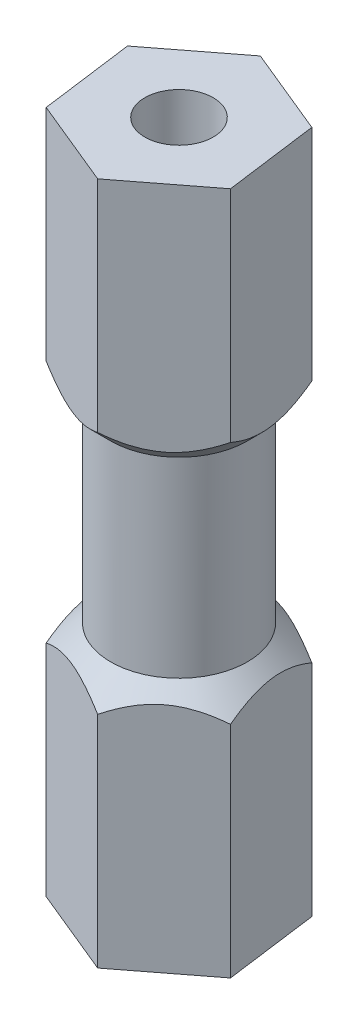
ISO-10303-21;
HEADER;
FILE_DESCRIPTION(('STEP AP214'),'2;1');
FILE_NAME('part.step','',(''),(''),'','','');
FILE_SCHEMA(('AUTOMOTIVE_DESIGN { 1 0 10303 214 1 1 1 1 }'));
ENDSEC;
DATA;
#1=APPLICATION_CONTEXT('core data for automotive mechanical design processes');
#2=APPLICATION_PROTOCOL_DEFINITION('international standard','automotive_design',2000,#1);
#3=PRODUCT_CONTEXT('',#1,'mechanical');
#4=PRODUCT('Part','Part','',(#3));
#5=PRODUCT_RELATED_PRODUCT_CATEGORY('part','',(#4));
#6=PRODUCT_DEFINITION_FORMATION('','',#4);
#7=PRODUCT_DEFINITION_CONTEXT('part definition',#1,'design');
#8=PRODUCT_DEFINITION('design','',#6,#7);
#9=PRODUCT_DEFINITION_SHAPE('','',#8);
#10=(LENGTH_UNIT() NAMED_UNIT(*) SI_UNIT(.MILLI.,.METRE.));
#11=(NAMED_UNIT(*) PLANE_ANGLE_UNIT() SI_UNIT($,.RADIAN.));
#12=(NAMED_UNIT(*) SI_UNIT($,.STERADIAN.) SOLID_ANGLE_UNIT());
#13=UNCERTAINTY_MEASURE_WITH_UNIT(LENGTH_MEASURE(1.E-05),#10,'distance_accuracy_value','');
#14=(GEOMETRIC_REPRESENTATION_CONTEXT(3) GLOBAL_UNCERTAINTY_ASSIGNED_CONTEXT((#13)) GLOBAL_UNIT_ASSIGNED_CONTEXT((#10,
#11,#12)) REPRESENTATION_CONTEXT('',''));
#15=CARTESIAN_POINT('',(0.,0.,0.));
#16=DIRECTION('',(0.,0.,1.));
#17=DIRECTION('',(1.,0.,0.));
#18=AXIS2_PLACEMENT_3D('',#15,#16,#17);
#19=CARTESIAN_POINT('',(0.,25.,0.));
#20=DIRECTION('',(0.,-1.,0.));
#21=DIRECTION('',(0.,0.,-1.));
#22=AXIS2_PLACEMENT_3D('',#19,#20,#21);
#23=CYLINDRICAL_SURFACE('',#22,2.5);
#24=CARTESIAN_POINT('',(0.,9.00000000000001,0.));
#25=DIRECTION('',(0.,-1.,0.));
#26=DIRECTION('',(0.,0.,-1.));
#27=AXIS2_PLACEMENT_3D('',#24,#25,#26);
#28=CIRCLE('',#27,2.5);
#29=CARTESIAN_POINT('',(0.,9.00000000000001,-2.5));
#30=VERTEX_POINT('',#29);
#31=EDGE_CURVE('E214',#30,#30,#28,.F.);
#32=ORIENTED_EDGE('',*,*,#31,.T.);
#33=EDGE_LOOP('',(#32));
#34=FACE_BOUND('',#33,.T.);
#35=CARTESIAN_POINT('',(0.,16.,0.));
#36=DIRECTION('',(0.,1.,0.));
#37=DIRECTION('',(0.,0.,1.));
#38=AXIS2_PLACEMENT_3D('',#35,#36,#37);
#39=CIRCLE('',#38,2.5);
#40=CARTESIAN_POINT('',(0.,16.,2.5));
#41=VERTEX_POINT('',#40);
#42=EDGE_CURVE('E204',#41,#41,#39,.F.);
#43=ORIENTED_EDGE('',*,*,#42,.T.);
#44=EDGE_LOOP('',(#43));
#45=FACE_BOUND('',#44,.T.);
#46=ADVANCED_FACE('F36',(#34,#45),#23,.T.);
#47=CARTESIAN_POINT('',(0.458624426145962,17.,3.43360796185911));
#48=DIRECTION('',(0.61025472680424,0.,0.792205256491701));
#49=DIRECTION('',(0.792205256491702,0.,-0.61025472680424));
#50=AXIS2_PLACEMENT_3D('',#47,#48,#49);
#51=PLANE('',#50);
#52=DIRECTION('',(0.792205256491701,0.,-0.61025472680424));
#53=VECTOR('',#52,1.);
#54=CARTESIAN_POINT('',(0.458624426145962,25.,3.43360796185911));
#55=LINE('',#54,#53);
#56=CARTESIAN_POINT('',(0.458624426145962,25.,3.43360796185911));
#57=VERTEX_POINT('',#56);
#58=CARTESIAN_POINT('',(3.20290393467948,25.,1.3196235770911));
#59=VERTEX_POINT('',#58);
#60=EDGE_CURVE('E176',#57,#59,#55,.T.);
#61=ORIENTED_EDGE('',*,*,#60,.F.);
#62=DIRECTION('',(0.,1.,0.));
#63=VECTOR('',#62,1.);
#64=CARTESIAN_POINT('',(0.458624426145962,17.,3.43360796185911));
#65=LINE('',#64,#63);
#66=CARTESIAN_POINT('',(0.458624426145962,16.9641016151377,3.43360796185911));
#67=VERTEX_POINT('',#66);
#68=EDGE_CURVE('E202',#67,#57,#65,.T.);
#69=ORIENTED_EDGE('',*,*,#68,.F.);
#70=CARTESIAN_POINT('',(0.458624426145962,16.9641016151377,3.43360796185911));
#71=CARTESIAN_POINT('',(0.552946646940671,16.9046273115043,3.36094929087585));
#72=CARTESIAN_POINT('',(0.648845946533506,16.8486466143714,3.28707575823494));
#73=CARTESIAN_POINT('',(0.844394459739393,16.7461483479953,3.13644004416266));
#74=CARTESIAN_POINT('',(0.944062259864258,16.6996877901198,3.05966354509507));
#75=CARTESIAN_POINT('',(1.14503747135759,16.6201005343435,2.90484751505832));
#76=CARTESIAN_POINT('',(1.24629372827786,16.586773851006,2.82684738958863));
#77=CARTESIAN_POINT('',(1.45103485264414,16.5354277758299,2.66913038646112));
#78=CARTESIAN_POINT('',(1.55451346985746,16.517370070364,2.58941832350757));
#79=CARTESIAN_POINT('',(1.73286339917489,16.5010768517386,2.45203109147486));
#80=CARTESIAN_POINT('',(1.80750452739339,16.4986656112775,2.39453323856858));
#81=CARTESIAN_POINT('',(1.9566652769835,16.502733133148,2.27963113239708));
#82=CARTESIAN_POINT('',(2.03118484660152,16.5092150115048,2.22222691899889));
#83=CARTESIAN_POINT('',(2.17951789139027,16.5306986609621,2.10796241370582));
#84=CARTESIAN_POINT('',(2.25333048312972,16.5457099577167,2.05110280233924));
#85=CARTESIAN_POINT('',(2.3996879271144,16.5834331286294,1.93836014977194));
#86=CARTESIAN_POINT('',(2.47223287613645,16.6061444122156,1.8824770340217));
#87=CARTESIAN_POINT('',(2.60100408474849,16.6528653293044,1.78328148073819));
#88=CARTESIAN_POINT('',(2.65751570690211,16.675645478675,1.73974922157174));
#89=CARTESIAN_POINT('',(2.76952470482908,16.7248761548282,1.65346600157362));
#90=CARTESIAN_POINT('',(2.82502204996649,16.7513267922701,1.61071506434156));
#91=CARTESIAN_POINT('',(2.93482762154907,16.8073056985693,1.52612919655211));
#92=CARTESIAN_POINT('',(2.989138970775,16.8368242879627,1.48429186044175));
#93=CARTESIAN_POINT('',(3.09675613798931,16.898551669424,1.40139177307215));
#94=CARTESIAN_POINT('',(3.15006254800882,16.9307588127747,1.36032856575713));
#95=CARTESIAN_POINT('',(3.20290393467948,16.9641016151377,1.3196235770911));
#96=B_SPLINE_CURVE_WITH_KNOTS('',3,(#70,#71,#72,#73,#74,#75,#76,#77,#78,#79,#80,#81,#82,#83,#84,
#85,#86,#87,#88,#89,#90,#91,#92,#93,#94,#95),.UNSPECIFIED.,.F.,.F.,(4,2,2,2,2,2,2,2,2,2,2,2,4),
(0.,0.399548839742044,0.801424624398822,1.19691998044429,1.59141997110855,1.87377108834638,
2.15622116275999,2.43898729915556,2.72173175291771,2.94627735489484,3.17082972803501,
3.39469398397017,3.61842195288712),.UNSPECIFIED.);
#97=CARTESIAN_POINT('',(3.20290393467948,16.9641016151377,1.3196235770911));
#98=VERTEX_POINT('',#97);
#99=EDGE_CURVE('E262',#67,#98,#96,.T.);
#100=ORIENTED_EDGE('',*,*,#99,.T.);
#101=DIRECTION('',(0.,1.,0.));
#102=VECTOR('',#101,1.);
#103=CARTESIAN_POINT('',(3.20290393467948,17.,1.3196235770911));
#104=LINE('',#103,#102);
#105=EDGE_CURVE('E201',#98,#59,#104,.T.);
#106=ORIENTED_EDGE('',*,*,#105,.T.);
#107=EDGE_LOOP('',(#61,#69,#100,#106));
#108=FACE_BOUND('',#107,.T.);
#109=ADVANCED_FACE('F273',(#108),#51,.T.);
#110=CARTESIAN_POINT('',(-2.74427950853352,17.,2.11398438476802));
#111=DIRECTION('',(-0.38094251373126,0.,0.924598724437855));
#112=DIRECTION('',(0.924598724437855,0.,0.38094251373126));
#113=AXIS2_PLACEMENT_3D('',#110,#111,#112);
#114=PLANE('',#113);
#115=DIRECTION('',(0.924598724437855,0.,0.38094251373126));
#116=VECTOR('',#115,1.);
#117=CARTESIAN_POINT('',(-2.74427950853352,25.,2.11398438476802));
#118=LINE('',#117,#116);
#119=CARTESIAN_POINT('',(-2.74427950853352,25.,2.11398438476802));
#120=VERTEX_POINT('',#119);
#121=EDGE_CURVE('E198',#120,#57,#118,.T.);
#122=ORIENTED_EDGE('',*,*,#121,.F.);
#123=DIRECTION('',(0.,1.,0.));
#124=VECTOR('',#123,1.);
#125=CARTESIAN_POINT('',(-2.74427950853352,17.,2.11398438476802));
#126=LINE('',#125,#124);
#127=CARTESIAN_POINT('',(-2.74427950853352,16.9641016151377,2.11398438476802));
#128=VERTEX_POINT('',#127);
#129=EDGE_CURVE('E55',#128,#120,#126,.T.);
#130=ORIENTED_EDGE('',*,*,#129,.F.);
#131=CARTESIAN_POINT('',(-2.74427950853352,16.9641016151377,2.11398438476802));
#132=CARTESIAN_POINT('',(-2.65476024921659,16.9157269497922,2.15086707860072));
#133=CARTESIAN_POINT('',(-2.56407437999802,16.8696980234631,2.18823042560407));
#134=CARTESIAN_POINT('',(-2.38077498355622,16.783998490478,2.26375133105245));
#135=CARTESIAN_POINT('',(-2.28817478965157,16.7442943295452,2.30190339605718));
#136=CARTESIAN_POINT('',(-2.10035754449794,16.672305037876,2.37928569347967));
#137=CARTESIAN_POINT('',(-2.0051374794881,16.6400288887305,2.41851716759246));
#138=CARTESIAN_POINT('',(-1.8119520952501,16.584391257025,2.49811118383178));
#139=CARTESIAN_POINT('',(-1.71397450618608,16.5610800623189,2.53847878123472));
#140=CARTESIAN_POINT('',(-1.61502958342202,16.5431603565392,2.57924492832366));
#141=B_SPLINE_CURVE_WITH_KNOTS('',3,(#131,#132,#133,#134,#135,#136,#137,#138,#139,#140),
.UNSPECIFIED.,.F.,.F.,(4,2,2,2,4),(0.,0.324780085634288,0.647775218636346,0.971158873405688,
1.29633093444723),.UNSPECIFIED.);
#142=CARTESIAN_POINT('',(-1.61502958342202,16.5431603565392,2.57924492832366));
#143=VERTEX_POINT('',#142);
#144=EDGE_CURVE('E11',#128,#143,#141,.T.);
#145=ORIENTED_EDGE('',*,*,#144,.T.);
#146=CARTESIAN_POINT('',(-1.61502958342202,16.5431603565392,2.57924492832366));
#147=CARTESIAN_POINT('',(-1.54558729717552,16.5305188398165,2.6078557390276));
#148=CARTESIAN_POINT('',(-1.47571117976237,16.5205729321314,2.63664529185045));
#149=CARTESIAN_POINT('',(-1.33546681959035,16.5062882086095,2.6944271573111));
#150=CARTESIAN_POINT('',(-1.26509853619652,16.5019498613806,2.72341948669085));
#151=CARTESIAN_POINT('',(-1.12576134312116,16.4991287729907,2.78082759161622));
#152=CARTESIAN_POINT('',(-1.05679464929385,16.5005229320105,2.8092424542111));
#153=CARTESIAN_POINT('',(-0.919172783065461,16.5088186837108,2.86594382993202));
#154=CARTESIAN_POINT('',(-0.850517531465092,16.5157187869493,2.89423037568883));
#155=CARTESIAN_POINT('',(-0.675685420253343,16.5401064692712,2.96626268783206));
#156=CARTESIAN_POINT('',(-0.56994667041001,16.5613532974712,3.00982794927952));
#157=CARTESIAN_POINT('',(-0.360777710411472,16.6150106987661,3.09600733424984));
#158=CARTESIAN_POINT('',(-0.257352275134171,16.647442434633,3.13861949048252));
#159=CARTESIAN_POINT('',(-0.0497733848083482,16.7227276288082,3.22414375326619));
#160=CARTESIAN_POINT('',(0.0542761646427828,16.7659094587898,3.26701304983008));
#161=CARTESIAN_POINT('',(0.258905277611954,16.8598312798089,3.35132197933295));
#162=CARTESIAN_POINT('',(0.35949795469334,16.9105376128439,3.39276701517121));
#163=CARTESIAN_POINT('',(0.458624426145963,16.9641016151377,3.43360796185911));
#164=B_SPLINE_CURVE_WITH_KNOTS('',3,(#146,#147,#148,#149,#150,#151,#152,#153,#154,#155,#156,
#157,#158,#159,#160,#161,#162,#163),.UNSPECIFIED.,.F.,.F.,(4,2,2,2,2,2,2,2,4),(0.,
0.228459959064639,0.45693900864685,0.680537607009109,0.904075739033715,1.25233896174798,
1.6012647756805,1.96254620732019,2.32225775447794),.UNSPECIFIED.);
#165=EDGE_CURVE('E251',#143,#67,#164,.T.);
#166=ORIENTED_EDGE('',*,*,#165,.T.);
#167=ORIENTED_EDGE('',*,*,#68,.T.);
#168=EDGE_LOOP('',(#122,#130,#145,#166,#167));
#169=FACE_BOUND('',#168,.T.);
#170=ADVANCED_FACE('F268',(#169),#114,.T.);
#171=CARTESIAN_POINT('',(-3.20290393467948,17.,-1.3196235770911));
#172=DIRECTION('',(-0.991197240535501,0.,0.132393467946154));
#173=DIRECTION('',(0.132393467946154,0.,0.991197240535501));
#174=AXIS2_PLACEMENT_3D('',#171,#172,#173);
#175=PLANE('',#174);
#176=DIRECTION('',(0.132393467946154,0.,0.991197240535501));
#177=VECTOR('',#176,1.);
#178=CARTESIAN_POINT('',(-3.20290393467948,25.,-1.3196235770911));
#179=LINE('',#178,#177);
#180=CARTESIAN_POINT('',(-3.20290393467948,25.,-1.3196235770911));
#181=VERTEX_POINT('',#180);
#182=EDGE_CURVE('E195',#181,#120,#179,.T.);
#183=ORIENTED_EDGE('',*,*,#182,.F.);
#184=DIRECTION('',(0.,1.,0.));
#185=VECTOR('',#184,1.);
#186=CARTESIAN_POINT('',(-3.20290393467948,17.,-1.3196235770911));
#187=LINE('',#186,#185);
#188=CARTESIAN_POINT('',(-3.20290393467948,16.9641016151377,-1.3196235770911));
#189=VERTEX_POINT('',#188);
#190=EDGE_CURVE('E62',#189,#181,#187,.T.);
#191=ORIENTED_EDGE('',*,*,#190,.F.);
#192=CARTESIAN_POINT('',(-3.20290393467948,16.9641016151377,-1.3196235770911));
#193=CARTESIAN_POINT('',(-3.18714079020011,16.9046273115043,-1.20160880224988));
#194=CARTESIAN_POINT('',(-3.1711140840622,16.8486466143714,-1.08162080627689));
#195=CARTESIAN_POINT('',(-3.13843398556135,16.7461483479953,-0.836952969132185));
#196=CARTESIAN_POINT('',(-3.12177748701761,16.6996877901198,-0.712249872750943));
#197=CARTESIAN_POINT('',(-3.0881904778394,16.6201005343435,-0.460792219048395));
#198=CARTESIAN_POINT('',(-3.07126851614441,16.586773851006,-0.334101665528471));
#199=CARTESIAN_POINT('',(-3.03705214701037,16.5354277758299,-0.0779321490641266));
#200=CARTESIAN_POINT('',(-3.0197587841112,16.517370070364,0.0515389936678663));
#201=CARTESIAN_POINT('',(-2.98995291567395,16.5010768517386,0.274688179236282));
#202=CARTESIAN_POINT('',(-2.9774788785033,16.4986656112775,0.368078218893769));
#203=CARTESIAN_POINT('',(-2.9525511104055,16.502733133148,0.554706270372083));
#204=CARTESIAN_POINT('',(-2.94009738812742,16.5092150115048,0.64794421743947));
#205=CARTESIAN_POINT('',(-2.91530794618713,16.5306986609621,0.833536655093754));
#206=CARTESIAN_POINT('',(-2.9029723741641,16.5457099577167,0.925890040342578));
#207=CARTESIAN_POINT('',(-2.87851309494311,16.5834331286294,1.10901063114992));
#208=CARTESIAN_POINT('',(-2.86638937157179,16.6061444122156,1.19977795779438));
#209=CARTESIAN_POINT('',(-2.84486910679185,16.6528653293044,1.36089487237019));
#210=CARTESIAN_POINT('',(-2.83542487554638,16.675645478675,1.43160150234752));
#211=CARTESIAN_POINT('',(-2.81670591407117,16.7248761548282,1.57174575000377));
#212=CARTESIAN_POINT('',(-2.80743118896132,16.7513267922701,1.64118332935139));
#213=CARTESIAN_POINT('',(-2.78908046444579,16.8073056985693,1.7785706777137));
#214=CARTESIAN_POINT('',(-2.78000394316052,16.8368242879627,1.84652435391235));
#215=CARTESIAN_POINT('',(-2.76201894512965,16.898551669424,1.98117359828806));
#216=CARTESIAN_POINT('',(-2.75311036944373,16.9307588127747,2.04786990720701));
#217=CARTESIAN_POINT('',(-2.74427950853352,16.9641016151377,2.11398438476802));
#218=B_SPLINE_CURVE_WITH_KNOTS('',3,(#192,#193,#194,#195,#196,#197,#198,#199,#200,#201,#202,
#203,#204,#205,#206,#207,#208,#209,#210,#211,#212,#213,#214,#215,#216,#217),.UNSPECIFIED.,.F.,
.F.,(4,2,2,2,2,2,2,2,2,2,2,2,4),(0.,0.399548839742042,0.801424624398822,1.19691998044429,
1.59141997110856,1.87377108834638,2.15622116275999,2.43898729915556,2.72173175291771,
2.94627735489484,3.17082972803501,3.39469398397017,3.61842195288713),.UNSPECIFIED.);
#219=EDGE_CURVE('E49',#189,#128,#218,.T.);
#220=ORIENTED_EDGE('',*,*,#219,.T.);
#221=ORIENTED_EDGE('',*,*,#129,.T.);
#222=EDGE_LOOP('',(#183,#191,#220,#221));
#223=FACE_BOUND('',#222,.T.);
#224=ADVANCED_FACE('F272',(#223),#175,.T.);
#225=CARTESIAN_POINT('',(-0.45862442614596,17.,-3.43360796185911));
#226=DIRECTION('',(-0.61025472680424,0.,-0.792205256491701));
#227=DIRECTION('',(-0.792205256491702,0.,0.61025472680424));
#228=AXIS2_PLACEMENT_3D('',#225,#226,#227);
#229=PLANE('',#228);
#230=DIRECTION('',(-0.792205256491701,0.,0.61025472680424));
#231=VECTOR('',#230,1.);
#232=CARTESIAN_POINT('',(-0.45862442614596,25.,-3.43360796185911));
#233=LINE('',#232,#231);
#234=CARTESIAN_POINT('',(-0.45862442614596,25.,-3.43360796185911));
#235=VERTEX_POINT('',#234);
#236=EDGE_CURVE('E192',#235,#181,#233,.T.);
#237=ORIENTED_EDGE('',*,*,#236,.F.);
#238=DIRECTION('',(0.,1.,0.));
#239=VECTOR('',#238,1.);
#240=CARTESIAN_POINT('',(-0.45862442614596,17.,-3.43360796185911));
#241=LINE('',#240,#239);
#242=CARTESIAN_POINT('',(-0.45862442614596,16.9641016151377,-3.43360796185911));
#243=VERTEX_POINT('',#242);
#244=EDGE_CURVE('E207',#243,#235,#241,.T.);
#245=ORIENTED_EDGE('',*,*,#244,.F.);
#246=CARTESIAN_POINT('',(-0.45862442614596,16.9641016151377,-3.43360796185911));
#247=CARTESIAN_POINT('',(-0.552946646940669,16.9046273115043,-3.36094929087585));
#248=CARTESIAN_POINT('',(-0.648845946533503,16.8486466143714,-3.28707575823493));
#249=CARTESIAN_POINT('',(-0.844394459739389,16.7461483479953,-3.13644004416266));
#250=CARTESIAN_POINT('',(-0.944062259864255,16.6996877901198,-3.05966354509507));
#251=CARTESIAN_POINT('',(-1.14503747135759,16.6201005343435,-2.90484751505832));
#252=CARTESIAN_POINT('',(-1.24629372827786,16.586773851006,-2.82684738958863));
#253=CARTESIAN_POINT('',(-1.45103485264414,16.5354277758299,-2.66913038646112));
#254=CARTESIAN_POINT('',(-1.55451346985746,16.517370070364,-2.58941832350757));
#255=CARTESIAN_POINT('',(-1.73286339917489,16.5010768517386,-2.45203109147485));
#256=CARTESIAN_POINT('',(-1.80750452739338,16.4986656112775,-2.39453323856858));
#257=CARTESIAN_POINT('',(-1.95666527698349,16.502733133148,-2.27963113239708));
#258=CARTESIAN_POINT('',(-2.03118484660152,16.5092150115048,-2.22222691899889));
#259=CARTESIAN_POINT('',(-2.17951789139026,16.5306986609621,-2.10796241370582));
#260=CARTESIAN_POINT('',(-2.25333048312972,16.5457099577167,-2.05110280233924));
#261=CARTESIAN_POINT('',(-2.3996879271144,16.5834331286294,-1.93836014977194));
#262=CARTESIAN_POINT('',(-2.47223287613644,16.6061444122156,-1.8824770340217));
#263=CARTESIAN_POINT('',(-2.60100408474849,16.6528653293044,-1.78328148073819));
#264=CARTESIAN_POINT('',(-2.65751570690211,16.675645478675,-1.73974922157174));
#265=CARTESIAN_POINT('',(-2.76952470482908,16.7248761548282,-1.65346600157362));
#266=CARTESIAN_POINT('',(-2.82502204996649,16.7513267922701,-1.61071506434155));
#267=CARTESIAN_POINT('',(-2.93482762154907,16.8073056985693,-1.52612919655211));
#268=CARTESIAN_POINT('',(-2.989138970775,16.8368242879627,-1.48429186044174));
#269=CARTESIAN_POINT('',(-3.09675613798931,16.898551669424,-1.40139177307215));
#270=CARTESIAN_POINT('',(-3.15006254800882,16.9307588127747,-1.36032856575712));
#271=CARTESIAN_POINT('',(-3.20290393467948,16.9641016151377,-1.3196235770911));
#272=B_SPLINE_CURVE_WITH_KNOTS('',3,(#246,#247,#248,#249,#250,#251,#252,#253,#254,#255,#256,
#257,#258,#259,#260,#261,#262,#263,#264,#265,#266,#267,#268,#269,#270,#271),.UNSPECIFIED.,.F.,
.F.,(4,2,2,2,2,2,2,2,2,2,2,2,4),(0.,0.399548839742042,0.801424624398821,1.19691998044429,
1.59141997110855,1.87377108834638,2.15622116275999,2.43898729915555,2.72173175291771,
2.94627735489484,3.17082972803501,3.39469398397017,3.61842195288712),.UNSPECIFIED.);
#273=EDGE_CURVE('E287',#243,#189,#272,.T.);
#274=ORIENTED_EDGE('',*,*,#273,.T.);
#275=ORIENTED_EDGE('',*,*,#190,.T.);
#276=EDGE_LOOP('',(#237,#245,#274,#275));
#277=FACE_BOUND('',#276,.T.);
#278=ADVANCED_FACE('F280',(#277),#229,.T.);
#279=CARTESIAN_POINT('',(2.74427950853352,17.,-2.11398438476802));
#280=DIRECTION('',(0.380942513731261,0.,-0.924598724437855));
#281=DIRECTION('',(-0.924598724437855,0.,-0.380942513731261));
#282=AXIS2_PLACEMENT_3D('',#279,#280,#281);
#283=PLANE('',#282);
#284=DIRECTION('',(-0.924598724437855,0.,-0.380942513731261));
#285=VECTOR('',#284,1.);
#286=CARTESIAN_POINT('',(2.74427950853352,25.,-2.11398438476802));
#287=LINE('',#286,#285);
#288=CARTESIAN_POINT('',(2.74427950853352,25.,-2.11398438476802));
#289=VERTEX_POINT('',#288);
#290=EDGE_CURVE('E189',#289,#235,#287,.T.);
#291=ORIENTED_EDGE('',*,*,#290,.F.);
#292=DIRECTION('',(0.,1.,0.));
#293=VECTOR('',#292,1.);
#294=CARTESIAN_POINT('',(2.74427950853352,17.,-2.11398438476802));
#295=LINE('',#294,#293);
#296=CARTESIAN_POINT('',(2.74427950853352,16.9641016151377,-2.11398438476802));
#297=VERTEX_POINT('',#296);
#298=EDGE_CURVE('E209',#297,#289,#295,.T.);
#299=ORIENTED_EDGE('',*,*,#298,.F.);
#300=CARTESIAN_POINT('',(2.74427950853352,16.9641016151377,-2.11398438476802));
#301=CARTESIAN_POINT('',(2.63419414325944,16.9046273115043,-2.15934048862597));
#302=CARTESIAN_POINT('',(2.5222681375287,16.8486466143714,-2.20545495195804));
#303=CARTESIAN_POINT('',(2.29403952582196,16.7461483479953,-2.29948707503048));
#304=CARTESIAN_POINT('',(2.17771522715335,16.6996877901198,-2.34741367234412));
#305=CARTESIAN_POINT('',(1.94315300648181,16.6201005343435,-2.44405529600993));
#306=CARTESIAN_POINT('',(1.82497478786655,16.586773851006,-2.49274572406016));
#307=CARTESIAN_POINT('',(1.58601729436623,16.5354277758299,-2.59119823739699));
#308=CARTESIAN_POINT('',(1.46524531425374,16.517370070364,-2.64095731717544));
#309=CARTESIAN_POINT('',(1.25708951649906,16.5010768517386,-2.72671927071113));
#310=CARTESIAN_POINT('',(1.16997435110992,16.4986656112775,-2.76261145746235));
#311=CARTESIAN_POINT('',(0.995885833422008,16.502733133148,-2.83433740276916));
#312=CARTESIAN_POINT('',(0.9089125415259,16.5092150115048,-2.87017113643836));
#313=CARTESIAN_POINT('',(0.735790054796866,16.5306986609621,-2.94149906879957));
#314=CARTESIAN_POINT('',(0.649641891034375,16.5457099577167,-2.97699284268182));
#315=CARTESIAN_POINT('',(0.478825167828705,16.5834331286294,-3.04737078092186));
#316=CARTESIAN_POINT('',(0.394156495435348,16.6061444122156,-3.08225499181608));
#317=CARTESIAN_POINT('',(0.243865022043357,16.6528653293044,-3.14417635310838));
#318=CARTESIAN_POINT('',(0.177909168644272,16.675645478675,-3.17135072391926));
#319=CARTESIAN_POINT('',(0.0471812092420939,16.7248761548282,-3.22521175157739));
#320=CARTESIAN_POINT('',(-0.0175908610051712,16.7513267922701,-3.25189839369295));
#321=CARTESIAN_POINT('',(-0.145747157103272,16.8073056985693,-3.30469987426581));
#322=CARTESIAN_POINT('',(-0.209135027614485,16.8368242879627,-3.33081621435409));
#323=CARTESIAN_POINT('',(-0.334737192859659,16.898551669424,-3.38256537136021));
#324=CARTESIAN_POINT('',(-0.39695217856509,16.9307588127747,-3.40819847296414));
#325=CARTESIAN_POINT('',(-0.458624426145959,16.9641016151377,-3.43360796185911));
#326=B_SPLINE_CURVE_WITH_KNOTS('',3,(#300,#301,#302,#303,#304,#305,#306,#307,#308,#309,#310,
#311,#312,#313,#314,#315,#316,#317,#318,#319,#320,#321,#322,#323,#324,#325),.UNSPECIFIED.,.F.,
.F.,(4,2,2,2,2,2,2,2,2,2,2,2,4),(0.,0.399548839742043,0.801424624398822,1.19691998044429,
1.59141997110856,1.87377108834638,2.15622116275999,2.43898729915556,2.72173175291771,
2.94627735489484,3.17082972803501,3.39469398397017,3.61842195288713),.UNSPECIFIED.);
#327=EDGE_CURVE('E292',#297,#243,#326,.T.);
#328=ORIENTED_EDGE('',*,*,#327,.T.);
#329=ORIENTED_EDGE('',*,*,#244,.T.);
#330=EDGE_LOOP('',(#291,#299,#328,#329));
#331=FACE_BOUND('',#330,.T.);
#332=ADVANCED_FACE('F302',(#331),#283,.T.);
#333=CARTESIAN_POINT('',(3.20290393467948,17.,1.3196235770911));
#334=DIRECTION('',(0.991197240535501,0.,-0.132393467946154));
#335=DIRECTION('',(-0.132393467946154,0.,-0.991197240535501));
#336=AXIS2_PLACEMENT_3D('',#333,#334,#335);
#337=PLANE('',#336);
#338=DIRECTION('',(-0.132393467946154,0.,-0.991197240535501));
#339=VECTOR('',#338,1.);
#340=CARTESIAN_POINT('',(3.20290393467948,25.,1.3196235770911));
#341=LINE('',#340,#339);
#342=EDGE_CURVE('E186',#59,#289,#341,.T.);
#343=ORIENTED_EDGE('',*,*,#342,.F.);
#344=ORIENTED_EDGE('',*,*,#105,.F.);
#345=CARTESIAN_POINT('',(3.20290393467948,16.9641016151377,1.3196235770911));
#346=CARTESIAN_POINT('',(3.18714079020011,16.9046273115043,1.20160880224988));
#347=CARTESIAN_POINT('',(3.1711140840622,16.8486466143714,1.0816208062769));
#348=CARTESIAN_POINT('',(3.13843398556135,16.7461483479953,0.836952969132185));
#349=CARTESIAN_POINT('',(3.12177748701761,16.6996877901198,0.712249872750943));
#350=CARTESIAN_POINT('',(3.0881904778394,16.6201005343435,0.460792219048393));
#351=CARTESIAN_POINT('',(3.07126851614441,16.586773851006,0.334101665528469));
#352=CARTESIAN_POINT('',(3.03705214701037,16.5354277758299,0.0779321490641236));
#353=CARTESIAN_POINT('',(3.0197587841112,16.517370070364,-0.0515389936678698));
#354=CARTESIAN_POINT('',(2.98995291567395,16.5010768517386,-0.274688179236286));
#355=CARTESIAN_POINT('',(2.9774788785033,16.4986656112775,-0.368078218893774));
#356=CARTESIAN_POINT('',(2.9525511104055,16.502733133148,-0.554706270372088));
#357=CARTESIAN_POINT('',(2.94009738812742,16.5092150115048,-0.647944217439476));
#358=CARTESIAN_POINT('',(2.91530794618713,16.5306986609621,-0.833536655093759));
#359=CARTESIAN_POINT('',(2.9029723741641,16.5457099577167,-0.925890040342584));
#360=CARTESIAN_POINT('',(2.8785130949431,16.5834331286294,-1.10901063114993));
#361=CARTESIAN_POINT('',(2.86638937157179,16.6061444122156,-1.19977795779439));
#362=CARTESIAN_POINT('',(2.84486910679185,16.6528653293044,-1.3608948723702));
#363=CARTESIAN_POINT('',(2.83542487554638,16.675645478675,-1.43160150234752));
#364=CARTESIAN_POINT('',(2.81670591407117,16.7248761548282,-1.57174575000378));
#365=CARTESIAN_POINT('',(2.80743118896131,16.7513267922701,-1.6411833293514));
#366=CARTESIAN_POINT('',(2.78908046444579,16.8073056985693,-1.7785706777137));
#367=CARTESIAN_POINT('',(2.78000394316052,16.8368242879627,-1.84652435391235));
#368=CARTESIAN_POINT('',(2.76201894512965,16.898551669424,-1.98117359828806));
#369=CARTESIAN_POINT('',(2.75311036944373,16.9307588127747,-2.04786990720701));
#370=CARTESIAN_POINT('',(2.74427950853352,16.9641016151377,-2.11398438476802));
#371=B_SPLINE_CURVE_WITH_KNOTS('',3,(#345,#346,#347,#348,#349,#350,#351,#352,#353,#354,#355,
#356,#357,#358,#359,#360,#361,#362,#363,#364,#365,#366,#367,#368,#369,#370),.UNSPECIFIED.,.F.,
.F.,(4,2,2,2,2,2,2,2,2,2,2,2,4),(0.,0.399548839742046,0.801424624398827,1.19691998044429,
1.59141997110856,1.87377108834639,2.15622116276,2.43898729915557,2.72173175291772,
2.94627735489485,3.17082972803502,3.39469398397018,3.61842195288713),.UNSPECIFIED.);
#372=EDGE_CURVE('E297',#98,#297,#371,.T.);
#373=ORIENTED_EDGE('',*,*,#372,.T.);
#374=ORIENTED_EDGE('',*,*,#298,.T.);
#375=EDGE_LOOP('',(#343,#344,#373,#374));
#376=FACE_BOUND('',#375,.T.);
#377=ADVANCED_FACE('F305',(#376),#337,.T.);
#378=CARTESIAN_POINT('',(0.,25.,0.));
#379=DIRECTION('',(0.,1.,0.));
#380=DIRECTION('',(0.,0.,1.));
#381=AXIS2_PLACEMENT_3D('',#378,#379,#380);
#382=PLANE('',#381);
#383=CARTESIAN_POINT('',(0.,25.,0.));
#384=DIRECTION('',(0.,-1.,0.));
#385=DIRECTION('',(0.,0.,-1.));
#386=AXIS2_PLACEMENT_3D('',#383,#384,#385);
#387=CIRCLE('',#386,1.25);
#388=CARTESIAN_POINT('',(0.,25.,-1.25));
#389=VERTEX_POINT('',#388);
#390=EDGE_CURVE('E510',#389,#389,#387,.T.);
#391=ORIENTED_EDGE('',*,*,#390,.T.);
#392=EDGE_LOOP('',(#391));
#393=FACE_BOUND('',#392,.T.);
#394=ORIENTED_EDGE('',*,*,#60,.T.);
#395=ORIENTED_EDGE('',*,*,#342,.T.);
#396=ORIENTED_EDGE('',*,*,#290,.T.);
#397=ORIENTED_EDGE('',*,*,#236,.T.);
#398=ORIENTED_EDGE('',*,*,#182,.T.);
#399=ORIENTED_EDGE('',*,*,#121,.T.);
#400=EDGE_LOOP('',(#394,#395,#396,#397,#398,#399));
#401=FACE_BOUND('',#400,.T.);
#402=ADVANCED_FACE('F309',(#393,#401),#382,.T.);
#403=CARTESIAN_POINT('',(2.74427950853352,8.,-2.11398438476802));
#404=DIRECTION('',(0.991197240535501,0.,-0.132393467946154));
#405=DIRECTION('',(-0.132393467946154,0.,-0.991197240535501));
#406=AXIS2_PLACEMENT_3D('',#403,#404,#405);
#407=PLANE('',#406);
#408=DIRECTION('',(0.132393467946154,0.,0.991197240535501));
#409=VECTOR('',#408,1.);
#410=CARTESIAN_POINT('',(2.74427950853352,0.,-2.11398438476802));
#411=LINE('',#410,#409);
#412=CARTESIAN_POINT('',(2.74427950853352,0.,-2.11398438476802));
#413=VERTEX_POINT('',#412);
#414=CARTESIAN_POINT('',(3.20290393467948,0.,1.3196235770911));
#415=VERTEX_POINT('',#414);
#416=EDGE_CURVE('E139',#413,#415,#411,.T.);
#417=ORIENTED_EDGE('',*,*,#416,.F.);
#418=DIRECTION('',(0.,-1.,0.));
#419=VECTOR('',#418,1.);
#420=CARTESIAN_POINT('',(2.74427950853352,8.,-2.11398438476802));
#421=LINE('',#420,#419);
#422=CARTESIAN_POINT('',(2.74427950853352,8.03589838486226,-2.11398438476802));
#423=VERTEX_POINT('',#422);
#424=EDGE_CURVE('E174',#423,#413,#421,.T.);
#425=ORIENTED_EDGE('',*,*,#424,.F.);
#426=CARTESIAN_POINT('',(2.74427950853352,8.03589838486226,-2.11398438476802));
#427=CARTESIAN_POINT('',(2.76004265301289,8.09537268849571,-1.9959696099268));
#428=CARTESIAN_POINT('',(2.7760693591508,8.15135338562856,-1.87598161395381));
#429=CARTESIAN_POINT('',(2.80874945765166,8.2538516520047,-1.6313137768091));
#430=CARTESIAN_POINT('',(2.82540595619539,8.30031220988016,-1.50661068042786));
#431=CARTESIAN_POINT('',(2.85899296537361,8.37989946565652,-1.25515302672531));
#432=CARTESIAN_POINT('',(2.87591492706859,8.413226148994,-1.12846247320539));
#433=CARTESIAN_POINT('',(2.91013129620263,8.46457222417013,-0.872292956741048));
#434=CARTESIAN_POINT('',(2.92742465910181,8.48262992963597,-0.742821814009055));
#435=CARTESIAN_POINT('',(2.95723052753905,8.49892314826136,-0.519672628440641));
#436=CARTESIAN_POINT('',(2.9697045647097,8.50133438872248,-0.426282588783153));
#437=CARTESIAN_POINT('',(2.9946323328075,8.49726686685198,-0.239654537304839));
#438=CARTESIAN_POINT('',(3.00708605508558,8.49078498849517,-0.146416590237452));
#439=CARTESIAN_POINT('',(3.03187549702587,8.4693013390379,0.039175847416832));
#440=CARTESIAN_POINT('',(3.04421106904891,8.45429004228332,0.131529232665657));
#441=CARTESIAN_POINT('',(3.0686703482699,8.41656687137056,0.314649823473001));
#442=CARTESIAN_POINT('',(3.08079407164121,8.39385558778436,0.405417150117458));
#443=CARTESIAN_POINT('',(3.10231433642116,8.34713467069563,0.566534064693269));
#444=CARTESIAN_POINT('',(3.11175856766662,8.32435452132502,0.637240694670598));
#445=CARTESIAN_POINT('',(3.13047752914183,8.27512384517184,0.777384942326854));
#446=CARTESIAN_POINT('',(3.13975225425169,8.24867320772993,0.846822521674473));
#447=CARTESIAN_POINT('',(3.15810297876721,8.19269430143066,0.98420987003678));
#448=CARTESIAN_POINT('',(3.16717950005249,8.1631757120373,1.05216354623543));
#449=CARTESIAN_POINT('',(3.18516449808335,8.10144833057595,1.18681279061114));
#450=CARTESIAN_POINT('',(3.19407307376928,8.06924118722529,1.2535090995301));
#451=CARTESIAN_POINT('',(3.20290393467948,8.03589838486226,1.3196235770911));
#452=B_SPLINE_CURVE_WITH_KNOTS('',3,(#426,#427,#428,#429,#430,#431,#432,#433,#434,#435,#436,
#437,#438,#439,#440,#441,#442,#443,#444,#445,#446,#447,#448,#449,#450,#451),.UNSPECIFIED.,.F.,
.F.,(4,2,2,2,2,2,2,2,2,2,2,2,4),(0.,0.399548839742043,0.801424624398823,1.19691998044429,
1.59141997110855,1.87377108834638,2.15622116275999,2.43898729915556,2.72173175291771,
2.94627735489484,3.17082972803501,3.39469398397018,3.61842195288713),.UNSPECIFIED.);
#453=CARTESIAN_POINT('',(3.20290393467948,8.03589838486226,1.3196235770911));
#454=VERTEX_POINT('',#453);
#455=EDGE_CURVE('E142',#423,#454,#452,.T.);
#456=ORIENTED_EDGE('',*,*,#455,.T.);
#457=DIRECTION('',(0.,-1.,0.));
#458=VECTOR('',#457,1.);
#459=CARTESIAN_POINT('',(3.20290393467948,8.,1.3196235770911));
#460=LINE('',#459,#458);
#461=EDGE_CURVE('E135',#454,#415,#460,.T.);
#462=ORIENTED_EDGE('',*,*,#461,.T.);
#463=EDGE_LOOP('',(#417,#425,#456,#462));
#464=FACE_BOUND('',#463,.T.);
#465=ADVANCED_FACE('F137',(#464),#407,.T.);
#466=CARTESIAN_POINT('',(-0.45862442614596,8.,-3.43360796185911));
#467=DIRECTION('',(0.380942513731261,0.,-0.924598724437855));
#468=DIRECTION('',(-0.924598724437855,0.,-0.380942513731261));
#469=AXIS2_PLACEMENT_3D('',#466,#467,#468);
#470=PLANE('',#469);
#471=DIRECTION('',(0.924598724437855,0.,0.380942513731261));
#472=VECTOR('',#471,1.);
#473=CARTESIAN_POINT('',(-0.45862442614596,0.,-3.43360796185911));
#474=LINE('',#473,#472);
#475=CARTESIAN_POINT('',(-0.45862442614596,0.,-3.43360796185911));
#476=VERTEX_POINT('',#475);
#477=EDGE_CURVE('E147',#476,#413,#474,.T.);
#478=ORIENTED_EDGE('',*,*,#477,.F.);
#479=DIRECTION('',(0.,-1.,0.));
#480=VECTOR('',#479,1.);
#481=CARTESIAN_POINT('',(-0.45862442614596,8.,-3.43360796185911));
#482=LINE('',#481,#480);
#483=CARTESIAN_POINT('',(-0.45862442614596,8.03589838486226,-3.43360796185911));
#484=VERTEX_POINT('',#483);
#485=EDGE_CURVE('E177',#484,#476,#482,.T.);
#486=ORIENTED_EDGE('',*,*,#485,.F.);
#487=CARTESIAN_POINT('',(-0.45862442614596,8.03589838486226,-3.43360796185911));
#488=CARTESIAN_POINT('',(-0.369105166829032,8.08427305020784,-3.39672526802641));
#489=CARTESIAN_POINT('',(-0.278419297610459,8.13030197653688,-3.35936192102306));
#490=CARTESIAN_POINT('',(-0.0951199011686616,8.21600150952199,-3.28384101557468));
#491=CARTESIAN_POINT('',(-0.0025197072640104,8.2557056704548,-3.24568895056995));
#492=CARTESIAN_POINT('',(0.185297537889624,8.32769496212401,-3.16830665314746));
#493=CARTESIAN_POINT('',(0.280517602899462,8.35997111126952,-3.12907517903467));
#494=CARTESIAN_POINT('',(0.473702987137462,8.41560874297504,-3.04948116279535));
#495=CARTESIAN_POINT('',(0.571680576201477,8.43891993768112,-3.00911356539242));
#496=CARTESIAN_POINT('',(0.670625498965541,8.45683964346084,-2.96834741830347));
#497=B_SPLINE_CURVE_WITH_KNOTS('',3,(#487,#488,#489,#490,#491,#492,#493,#494,#495,#496),
.UNSPECIFIED.,.F.,.F.,(4,2,2,2,4),(0.,0.324780085634286,0.647775218636343,0.971158873405685,
1.29633093444723),.UNSPECIFIED.);
#498=CARTESIAN_POINT('',(0.670625498965542,8.45683964346084,-2.96834741830347));
#499=VERTEX_POINT('',#498);
#500=EDGE_CURVE('E245',#484,#499,#497,.T.);
#501=ORIENTED_EDGE('',*,*,#500,.T.);
#502=CARTESIAN_POINT('',(0.670625498965542,8.45683964346084,-2.96834741830347));
#503=CARTESIAN_POINT('',(0.740067785212044,8.4694811601835,-2.93973660759954));
#504=CARTESIAN_POINT('',(0.809943902625188,8.47942706786863,-2.91094705477669));
#505=CARTESIAN_POINT('',(0.950188262797211,8.49371179139053,-2.85316518931603));
#506=CARTESIAN_POINT('',(1.02055654619104,8.49805013861937,-2.82417285993628));
#507=CARTESIAN_POINT('',(1.1598937392664,8.50087122700931,-2.76676475501092));
#508=CARTESIAN_POINT('',(1.22886043309371,8.49947706798954,-2.73834989241603));
#509=CARTESIAN_POINT('',(1.3664822993221,8.49118131628924,-2.68164851669511));
#510=CARTESIAN_POINT('',(1.43513755092247,8.4842812130507,-2.65336197093831));
#511=CARTESIAN_POINT('',(1.60996966213422,8.45989353072877,-2.58132965879507));
#512=CARTESIAN_POINT('',(1.71570841197755,8.43864670252881,-2.53776439734761));
#513=CARTESIAN_POINT('',(1.92487737197609,8.38498930123391,-2.45158501237729));
#514=CARTESIAN_POINT('',(2.02830280725339,8.35255756536695,-2.40897285614461));
#515=CARTESIAN_POINT('',(2.23588169757921,8.27727237119179,-2.32344859336094));
#516=CARTESIAN_POINT('',(2.33993124703035,8.2340905412102,-2.28057929679706));
#517=CARTESIAN_POINT('',(2.54456035999952,8.14016872019114,-2.19627036729419));
#518=CARTESIAN_POINT('',(2.6451530370809,8.08946238715607,-2.15482533145592));
#519=CARTESIAN_POINT('',(2.74427950853352,8.03589838486226,-2.11398438476802));
#520=B_SPLINE_CURVE_WITH_KNOTS('',3,(#502,#503,#504,#505,#506,#507,#508,#509,#510,#511,#512,
#513,#514,#515,#516,#517,#518,#519),.UNSPECIFIED.,.F.,.F.,(4,2,2,2,2,2,2,2,4),(0.,
0.228459959064639,0.45693900864685,0.680537607009108,0.904075739033714,1.25233896174798,
1.60126477568051,1.96254620732019,2.32225775447794),.UNSPECIFIED.);
#521=EDGE_CURVE('E217',#499,#423,#520,.T.);
#522=ORIENTED_EDGE('',*,*,#521,.T.);
#523=ORIENTED_EDGE('',*,*,#424,.T.);
#524=EDGE_LOOP('',(#478,#486,#501,#522,#523));
#525=FACE_BOUND('',#524,.T.);
#526=ADVANCED_FACE('F232',(#525),#470,.T.);
#527=CARTESIAN_POINT('',(-3.20290393467948,8.,-1.3196235770911));
#528=DIRECTION('',(-0.61025472680424,0.,-0.792205256491701));
#529=DIRECTION('',(-0.792205256491702,0.,0.61025472680424));
#530=AXIS2_PLACEMENT_3D('',#527,#528,#529);
#531=PLANE('',#530);
#532=DIRECTION('',(0.792205256491701,0.,-0.61025472680424));
#533=VECTOR('',#532,1.);
#534=CARTESIAN_POINT('',(-3.20290393467948,0.,-1.3196235770911));
#535=LINE('',#534,#533);
#536=CARTESIAN_POINT('',(-3.20290393467948,0.,-1.3196235770911));
#537=VERTEX_POINT('',#536);
#538=EDGE_CURVE('E171',#537,#476,#535,.T.);
#539=ORIENTED_EDGE('',*,*,#538,.F.);
#540=DIRECTION('',(0.,-1.,0.));
#541=VECTOR('',#540,1.);
#542=CARTESIAN_POINT('',(-3.20290393467948,8.,-1.3196235770911));
#543=LINE('',#542,#541);
#544=CARTESIAN_POINT('',(-3.20290393467948,8.03589838486226,-1.3196235770911));
#545=VERTEX_POINT('',#544);
#546=EDGE_CURVE('E179',#545,#537,#543,.T.);
#547=ORIENTED_EDGE('',*,*,#546,.F.);
#548=CARTESIAN_POINT('',(-3.20290393467948,8.03589838486226,-1.3196235770911));
#549=CARTESIAN_POINT('',(-3.10858171388477,8.09537268849571,-1.39228224807436));
#550=CARTESIAN_POINT('',(-3.01268241429194,8.15135338562856,-1.46615578071528));
#551=CARTESIAN_POINT('',(-2.81713390108605,8.2538516520047,-1.61679149478755));
#552=CARTESIAN_POINT('',(-2.71746610096119,8.30031220988016,-1.69356799385514));
#553=CARTESIAN_POINT('',(-2.51649088946785,8.37989946565652,-1.84838402389189));
#554=CARTESIAN_POINT('',(-2.41523463254758,8.413226148994,-1.92638414936158));
#555=CARTESIAN_POINT('',(-2.2104935081813,8.46457222417013,-2.08410115248909));
#556=CARTESIAN_POINT('',(-2.10701489096798,8.48262992963597,-2.16381321544264));
#557=CARTESIAN_POINT('',(-1.92866496165055,8.49892314826136,-2.30120044747536));
#558=CARTESIAN_POINT('',(-1.85402383343206,8.50133438872248,-2.35869830038163));
#559=CARTESIAN_POINT('',(-1.70486308384195,8.49726686685198,-2.47360040655313));
#560=CARTESIAN_POINT('',(-1.63034351422392,8.49078498849517,-2.53100461995132));
#561=CARTESIAN_POINT('',(-1.48201046943518,8.4693013390379,-2.64526912524439));
#562=CARTESIAN_POINT('',(-1.40819787769572,8.45429004228332,-2.70212873661097));
#563=CARTESIAN_POINT('',(-1.26184043371104,8.41656687137056,-2.81487138917827));
#564=CARTESIAN_POINT('',(-1.189295484689,8.39385558778436,-2.87075450492851));
#565=CARTESIAN_POINT('',(-1.06052427607695,8.34713467069563,-2.96995005821202));
#566=CARTESIAN_POINT('',(-1.00401265392333,8.32435452132502,-3.01348231737847));
#567=CARTESIAN_POINT('',(-0.892003655996361,8.27512384517184,-3.09976553737659));
#568=CARTESIAN_POINT('',(-0.836506310858955,8.24867320772993,-3.14251647460866));
#569=CARTESIAN_POINT('',(-0.726700739276376,8.19269430143066,-3.2271023423981));
#570=CARTESIAN_POINT('',(-0.672389390050442,8.1631757120373,-3.26893967850847));
#571=CARTESIAN_POINT('',(-0.564772222836132,8.10144833057595,-3.35183976587806));
#572=CARTESIAN_POINT('',(-0.511465812816624,8.06924118722529,-3.39290297319308));
#573=CARTESIAN_POINT('',(-0.45862442614596,8.03589838486226,-3.43360796185911));
#574=B_SPLINE_CURVE_WITH_KNOTS('',3,(#548,#549,#550,#551,#552,#553,#554,#555,#556,#557,#558,
#559,#560,#561,#562,#563,#564,#565,#566,#567,#568,#569,#570,#571,#572,#573),.UNSPECIFIED.,.F.,
.F.,(4,2,2,2,2,2,2,2,2,2,2,2,4),(0.,0.399548839742043,0.801424624398822,1.19691998044429,
1.59141997110855,1.87377108834638,2.15622116275999,2.43898729915556,2.72173175291771,
2.94627735489484,3.17082972803501,3.39469398397017,3.61842195288712),.UNSPECIFIED.);
#575=EDGE_CURVE('E252',#545,#484,#574,.T.);
#576=ORIENTED_EDGE('',*,*,#575,.T.);
#577=ORIENTED_EDGE('',*,*,#485,.T.);
#578=EDGE_LOOP('',(#539,#547,#576,#577));
#579=FACE_BOUND('',#578,.T.);
#580=ADVANCED_FACE('F237',(#579),#531,.T.);
#581=CARTESIAN_POINT('',(-2.74427950853352,8.,2.11398438476802));
#582=DIRECTION('',(-0.991197240535501,0.,0.132393467946154));
#583=DIRECTION('',(0.132393467946154,0.,0.991197240535501));
#584=AXIS2_PLACEMENT_3D('',#581,#582,#583);
#585=PLANE('',#584);
#586=DIRECTION('',(-0.132393467946154,0.,-0.991197240535501));
#587=VECTOR('',#586,1.);
#588=CARTESIAN_POINT('',(-2.74427950853352,0.,2.11398438476802));
#589=LINE('',#588,#587);
#590=CARTESIAN_POINT('',(-2.74427950853352,0.,2.11398438476802));
#591=VERTEX_POINT('',#590);
#592=EDGE_CURVE('E168',#591,#537,#589,.T.);
#593=ORIENTED_EDGE('',*,*,#592,.F.);
#594=DIRECTION('',(0.,-1.,0.));
#595=VECTOR('',#594,1.);
#596=CARTESIAN_POINT('',(-2.74427950853352,8.,2.11398438476802));
#597=LINE('',#596,#595);
#598=CARTESIAN_POINT('',(-2.74427950853352,8.03589838486226,2.11398438476802));
#599=VERTEX_POINT('',#598);
#600=EDGE_CURVE('E181',#599,#591,#597,.T.);
#601=ORIENTED_EDGE('',*,*,#600,.F.);
#602=CARTESIAN_POINT('',(-2.74427950853352,8.03589838486226,2.11398438476802));
#603=CARTESIAN_POINT('',(-2.76004265301289,8.09537268849571,1.9959696099268));
#604=CARTESIAN_POINT('',(-2.7760693591508,8.15135338562856,1.87598161395381));
#605=CARTESIAN_POINT('',(-2.80874945765166,8.2538516520047,1.6313137768091));
#606=CARTESIAN_POINT('',(-2.82540595619539,8.30031220988016,1.50661068042786));
#607=CARTESIAN_POINT('',(-2.8589929653736,8.37989946565652,1.25515302672531));
#608=CARTESIAN_POINT('',(-2.87591492706859,8.413226148994,1.12846247320539));
#609=CARTESIAN_POINT('',(-2.91013129620263,8.46457222417013,0.872292956741047));
#610=CARTESIAN_POINT('',(-2.92742465910181,8.48262992963597,0.742821814009055));
#611=CARTESIAN_POINT('',(-2.95723052753905,8.49892314826137,0.51967262844064));
#612=CARTESIAN_POINT('',(-2.9697045647097,8.50133438872248,0.426282588783153));
#613=CARTESIAN_POINT('',(-2.9946323328075,8.49726686685198,0.239654537304839));
#614=CARTESIAN_POINT('',(-3.00708605508558,8.49078498849517,0.146416590237452));
#615=CARTESIAN_POINT('',(-3.03187549702587,8.4693013390379,-0.039175847416832));
#616=CARTESIAN_POINT('',(-3.04421106904891,8.45429004228332,-0.131529232665657));
#617=CARTESIAN_POINT('',(-3.0686703482699,8.41656687137056,-0.314649823473001));
#618=CARTESIAN_POINT('',(-3.08079407164121,8.39385558778436,-0.405417150117458));
#619=CARTESIAN_POINT('',(-3.10231433642116,8.34713467069563,-0.566534064693268));
#620=CARTESIAN_POINT('',(-3.11175856766662,8.32435452132502,-0.637240694670596));
#621=CARTESIAN_POINT('',(-3.13047752914183,8.27512384517184,-0.777384942326851));
#622=CARTESIAN_POINT('',(-3.13975225425169,8.24867320772993,-0.846822521674471));
#623=CARTESIAN_POINT('',(-3.15810297876721,8.19269430143066,-0.984209870036777));
#624=CARTESIAN_POINT('',(-3.16717950005249,8.1631757120373,-1.05216354623543));
#625=CARTESIAN_POINT('',(-3.18516449808335,8.10144833057596,-1.18681279061114));
#626=CARTESIAN_POINT('',(-3.19407307376928,8.06924118722529,-1.25350909953009));
#627=CARTESIAN_POINT('',(-3.20290393467948,8.03589838486226,-1.3196235770911));
#628=B_SPLINE_CURVE_WITH_KNOTS('',3,(#602,#603,#604,#605,#606,#607,#608,#609,#610,#611,#612,
#613,#614,#615,#616,#617,#618,#619,#620,#621,#622,#623,#624,#625,#626,#627),.UNSPECIFIED.,.F.,
.F.,(4,2,2,2,2,2,2,2,2,2,2,2,4),(0.,0.399548839742044,0.801424624398825,1.19691998044429,
1.59141997110856,1.87377108834638,2.15622116275999,2.43898729915556,2.72173175291771,
2.94627735489484,3.17082972803501,3.39469398397017,3.61842195288713),.UNSPECIFIED.);
#629=EDGE_CURVE('E539',#599,#545,#628,.T.);
#630=ORIENTED_EDGE('',*,*,#629,.T.);
#631=ORIENTED_EDGE('',*,*,#546,.T.);
#632=EDGE_LOOP('',(#593,#601,#630,#631));
#633=FACE_BOUND('',#632,.T.);
#634=ADVANCED_FACE('F379',(#633),#585,.T.);
#635=CARTESIAN_POINT('',(0.458624426145962,8.,3.43360796185911));
#636=DIRECTION('',(-0.38094251373126,0.,0.924598724437855));
#637=DIRECTION('',(0.924598724437855,0.,0.38094251373126));
#638=AXIS2_PLACEMENT_3D('',#635,#636,#637);
#639=PLANE('',#638);
#640=DIRECTION('',(-0.924598724437855,0.,-0.38094251373126));
#641=VECTOR('',#640,1.);
#642=CARTESIAN_POINT('',(0.458624426145962,0.,3.43360796185911));
#643=LINE('',#642,#641);
#644=CARTESIAN_POINT('',(0.458624426145962,0.,3.43360796185911));
#645=VERTEX_POINT('',#644);
#646=EDGE_CURVE('E155',#645,#591,#643,.T.);
#647=ORIENTED_EDGE('',*,*,#646,.F.);
#648=DIRECTION('',(0.,-1.,0.));
#649=VECTOR('',#648,1.);
#650=CARTESIAN_POINT('',(0.458624426145962,8.,3.43360796185911));
#651=LINE('',#650,#649);
#652=CARTESIAN_POINT('',(0.458624426145962,8.03589838486226,3.43360796185911));
#653=VERTEX_POINT('',#652);
#654=EDGE_CURVE('E146',#653,#645,#651,.T.);
#655=ORIENTED_EDGE('',*,*,#654,.F.);
#656=CARTESIAN_POINT('',(0.458624426145963,8.03589838486226,3.43360796185911));
#657=CARTESIAN_POINT('',(0.348539060871884,8.09537268849571,3.38825185800117));
#658=CARTESIAN_POINT('',(0.236613055141136,8.15135338562856,3.34213739466909));
#659=CARTESIAN_POINT('',(0.00838444343439654,8.2538516520047,3.24810527159665));
#660=CARTESIAN_POINT('',(-0.107939855234207,8.30031220988015,3.20017867428301));
#661=CARTESIAN_POINT('',(-0.34250207590575,8.37989946565651,3.1035370506172));
#662=CARTESIAN_POINT('',(-0.46068029452101,8.413226148994,3.05484662256697));
#663=CARTESIAN_POINT('',(-0.699637788021327,8.46457222417013,2.95639410923014));
#664=CARTESIAN_POINT('',(-0.820409768133821,8.48262992963597,2.90663502945169));
#665=CARTESIAN_POINT('',(-1.0285655658885,8.49892314826136,2.820873075916));
#666=CARTESIAN_POINT('',(-1.11568073127764,8.50133438872248,2.78498088916479));
#667=CARTESIAN_POINT('',(-1.28976924896555,8.49726686685198,2.71325494385797));
#668=CARTESIAN_POINT('',(-1.37674254086166,8.49078498849517,2.67742121018877));
#669=CARTESIAN_POINT('',(-1.5498650275907,8.4693013390379,2.60609327782756));
#670=CARTESIAN_POINT('',(-1.63601319135319,8.45429004228332,2.57059950394531));
#671=CARTESIAN_POINT('',(-1.80682991455886,8.41656687137056,2.50022156570527));
#672=CARTESIAN_POINT('',(-1.89149858695221,8.39385558778436,2.46533735481106));
#673=CARTESIAN_POINT('',(-2.0417900603442,8.34713467069563,2.40341599351875));
#674=CARTESIAN_POINT('',(-2.10774591374329,8.32435452132502,2.37624162270787));
#675=CARTESIAN_POINT('',(-2.23847387314547,8.27512384517184,2.32238059504974));
#676=CARTESIAN_POINT('',(-2.30324594339273,8.24867320772993,2.29569395293419));
#677=CARTESIAN_POINT('',(-2.43140223949083,8.19269430143066,2.24289247236132));
#678=CARTESIAN_POINT('',(-2.49479011000205,8.1631757120373,2.21677613227304));
#679=CARTESIAN_POINT('',(-2.62039227524722,8.10144833057596,2.16502697526693));
#680=CARTESIAN_POINT('',(-2.68260726095265,8.06924118722529,2.13939387366299));
#681=CARTESIAN_POINT('',(-2.74427950853352,8.03589838486226,2.11398438476802));
#682=B_SPLINE_CURVE_WITH_KNOTS('',3,(#656,#657,#658,#659,#660,#661,#662,#663,#664,#665,#666,
#667,#668,#669,#670,#671,#672,#673,#674,#675,#676,#677,#678,#679,#680,#681),.UNSPECIFIED.,.F.,
.F.,(4,2,2,2,2,2,2,2,2,2,2,2,4),(0.,0.399548839742044,0.801424624398825,1.19691998044429,
1.59141997110856,1.87377108834638,2.15622116276,2.43898729915556,2.72173175291771,
2.94627735489484,3.17082972803501,3.39469398397018,3.61842195288713),.UNSPECIFIED.);
#683=EDGE_CURVE('E540',#653,#599,#682,.T.);
#684=ORIENTED_EDGE('',*,*,#683,.T.);
#685=ORIENTED_EDGE('',*,*,#600,.T.);
#686=EDGE_LOOP('',(#647,#655,#684,#685));
#687=FACE_BOUND('',#686,.T.);
#688=ADVANCED_FACE('F386',(#687),#639,.T.);
#689=CARTESIAN_POINT('',(3.20290393467948,8.,1.3196235770911));
#690=DIRECTION('',(0.61025472680424,0.,0.792205256491701));
#691=DIRECTION('',(0.792205256491702,0.,-0.61025472680424));
#692=AXIS2_PLACEMENT_3D('',#689,#690,#691);
#693=PLANE('',#692);
#694=DIRECTION('',(-0.792205256491701,0.,0.61025472680424));
#695=VECTOR('',#694,1.);
#696=CARTESIAN_POINT('',(3.20290393467948,0.,1.3196235770911));
#697=LINE('',#696,#695);
#698=EDGE_CURVE('E150',#415,#645,#697,.T.);
#699=ORIENTED_EDGE('',*,*,#698,.F.);
#700=ORIENTED_EDGE('',*,*,#461,.F.);
#701=CARTESIAN_POINT('',(3.20290393467948,8.03589838486226,1.3196235770911));
#702=CARTESIAN_POINT('',(3.10858171388477,8.09537268849571,1.39228224807437));
#703=CARTESIAN_POINT('',(3.01268241429194,8.15135338562856,1.46615578071528));
#704=CARTESIAN_POINT('',(2.81713390108605,8.2538516520047,1.61679149478755));
#705=CARTESIAN_POINT('',(2.71746610096119,8.30031220988015,1.69356799385515));
#706=CARTESIAN_POINT('',(2.51649088946786,8.37989946565651,1.84838402389189));
#707=CARTESIAN_POINT('',(2.41523463254759,8.413226148994,1.92638414936158));
#708=CARTESIAN_POINT('',(2.21049350818131,8.46457222417013,2.0841011524891));
#709=CARTESIAN_POINT('',(2.10701489096799,8.48262992963597,2.16381321544264));
#710=CARTESIAN_POINT('',(1.92866496165056,8.49892314826136,2.30120044747536));
#711=CARTESIAN_POINT('',(1.85402383343206,8.50133438872248,2.35869830038163));
#712=CARTESIAN_POINT('',(1.70486308384195,8.49726686685198,2.47360040655313));
#713=CARTESIAN_POINT('',(1.63034351422392,8.49078498849516,2.53100461995132));
#714=CARTESIAN_POINT('',(1.48201046943518,8.46930133903789,2.6452691252444));
#715=CARTESIAN_POINT('',(1.40819787769572,8.45429004228332,2.70212873661097));
#716=CARTESIAN_POINT('',(1.26184043371104,8.41656687137056,2.81487138917828));
#717=CARTESIAN_POINT('',(1.189295484689,8.39385558778435,2.87075450492852));
#718=CARTESIAN_POINT('',(1.06052427607695,8.34713467069563,2.96995005821202));
#719=CARTESIAN_POINT('',(1.00401265392333,8.32435452132501,3.01348231737847));
#720=CARTESIAN_POINT('',(0.892003655996364,8.27512384517184,3.09976553737659));
#721=CARTESIAN_POINT('',(0.836506310858958,8.24867320772993,3.14251647460866));
#722=CARTESIAN_POINT('',(0.726700739276379,8.19269430143066,3.2271023423981));
#723=CARTESIAN_POINT('',(0.672389390050445,8.1631757120373,3.26893967850847));
#724=CARTESIAN_POINT('',(0.564772222836134,8.10144833057595,3.35183976587806));
#725=CARTESIAN_POINT('',(0.511465812816626,8.06924118722529,3.39290297319309));
#726=CARTESIAN_POINT('',(0.458624426145963,8.03589838486226,3.43360796185911));
#727=B_SPLINE_CURVE_WITH_KNOTS('',3,(#701,#702,#703,#704,#705,#706,#707,#708,#709,#710,#711,
#712,#713,#714,#715,#716,#717,#718,#719,#720,#721,#722,#723,#724,#725,#726),.UNSPECIFIED.,.F.,
.F.,(4,2,2,2,2,2,2,2,2,2,2,2,4),(0.,0.399548839742043,0.801424624398821,1.19691998044428,
1.59141997110855,1.87377108834638,2.15622116275999,2.43898729915556,2.72173175291771,
2.94627735489484,3.17082972803501,3.39469398397017,3.61842195288712),.UNSPECIFIED.);
#728=EDGE_CURVE('E534',#454,#653,#727,.T.);
#729=ORIENTED_EDGE('',*,*,#728,.T.);
#730=ORIENTED_EDGE('',*,*,#654,.T.);
#731=EDGE_LOOP('',(#699,#700,#729,#730));
#732=FACE_BOUND('',#731,.T.);
#733=ADVANCED_FACE('F151',(#732),#693,.T.);
#734=CARTESIAN_POINT('',(0.,0.,0.));
#735=DIRECTION('',(0.,1.,0.));
#736=DIRECTION('',(0.,0.,1.));
#737=AXIS2_PLACEMENT_3D('',#734,#735,#736);
#738=PLANE('',#737);
#739=CARTESIAN_POINT('',(0.,0.,0.));
#740=DIRECTION('',(0.,1.,0.));
#741=DIRECTION('',(0.,0.,1.));
#742=AXIS2_PLACEMENT_3D('',#739,#740,#741);
#743=CIRCLE('',#742,1.25);
#744=CARTESIAN_POINT('',(0.,0.,1.25));
#745=VERTEX_POINT('',#744);
#746=EDGE_CURVE('E163',#745,#745,#743,.T.);
#747=ORIENTED_EDGE('',*,*,#746,.T.);
#748=EDGE_LOOP('',(#747));
#749=FACE_BOUND('',#748,.T.);
#750=ORIENTED_EDGE('',*,*,#416,.T.);
#751=ORIENTED_EDGE('',*,*,#698,.T.);
#752=ORIENTED_EDGE('',*,*,#646,.T.);
#753=ORIENTED_EDGE('',*,*,#592,.T.);
#754=ORIENTED_EDGE('',*,*,#538,.T.);
#755=ORIENTED_EDGE('',*,*,#477,.T.);
#756=EDGE_LOOP('',(#750,#751,#752,#753,#754,#755));
#757=FACE_BOUND('',#756,.T.);
#758=ADVANCED_FACE('F157',(#749,#757),#738,.F.);
#759=CARTESIAN_POINT('',(0.,8.,0.));
#760=DIRECTION('',(0.,-1.,0.));
#761=DIRECTION('',(0.,0.,-1.));
#762=AXIS2_PLACEMENT_3D('',#759,#760,#761);
#763=CONICAL_SURFACE('',#762,3.50000000000002,0.785398163397453);
#764=ORIENTED_EDGE('',*,*,#31,.F.);
#765=EDGE_LOOP('',(#764));
#766=FACE_BOUND('',#765,.T.);
#767=ORIENTED_EDGE('',*,*,#455,.F.);
#768=ORIENTED_EDGE('',*,*,#521,.F.);
#769=ORIENTED_EDGE('',*,*,#500,.F.);
#770=ORIENTED_EDGE('',*,*,#575,.F.);
#771=ORIENTED_EDGE('',*,*,#629,.F.);
#772=ORIENTED_EDGE('',*,*,#683,.F.);
#773=ORIENTED_EDGE('',*,*,#728,.F.);
#774=EDGE_LOOP('',(#767,#768,#769,#770,#771,#772,#773));
#775=FACE_BOUND('',#774,.T.);
#776=ADVANCED_FACE('F229',(#766,#775),#763,.T.);
#777=CARTESIAN_POINT('',(0.,17.,0.));
#778=DIRECTION('',(0.,1.,0.));
#779=DIRECTION('',(0.,0.,1.));
#780=AXIS2_PLACEMENT_3D('',#777,#778,#779);
#781=CONICAL_SURFACE('',#780,3.50000000000002,0.785398163397453);
#782=ORIENTED_EDGE('',*,*,#42,.F.);
#783=EDGE_LOOP('',(#782));
#784=FACE_BOUND('',#783,.T.);
#785=ORIENTED_EDGE('',*,*,#99,.F.);
#786=ORIENTED_EDGE('',*,*,#165,.F.);
#787=ORIENTED_EDGE('',*,*,#144,.F.);
#788=ORIENTED_EDGE('',*,*,#219,.F.);
#789=ORIENTED_EDGE('',*,*,#273,.F.);
#790=ORIENTED_EDGE('',*,*,#327,.F.);
#791=ORIENTED_EDGE('',*,*,#372,.F.);
#792=EDGE_LOOP('',(#785,#786,#787,#788,#789,#790,#791));
#793=FACE_BOUND('',#792,.T.);
#794=ADVANCED_FACE('F38',(#784,#793),#781,.T.);
#795=CARTESIAN_POINT('',(0.,8.,0.));
#796=DIRECTION('',(0.,-1.,0.));
#797=DIRECTION('',(0.,0.,-1.));
#798=AXIS2_PLACEMENT_3D('',#795,#796,#797);
#799=CYLINDRICAL_SURFACE('',#798,1.25);
#800=CARTESIAN_POINT('',(0.,8.,0.));
#801=DIRECTION('',(0.,1.,0.));
#802=DIRECTION('',(0.,0.,1.));
#803=AXIS2_PLACEMENT_3D('',#800,#801,#802);
#804=CIRCLE('',#803,1.25);
#805=CARTESIAN_POINT('',(0.,8.,1.25));
#806=VERTEX_POINT('',#805);
#807=EDGE_CURVE('E160',#806,#806,#804,.T.);
#808=ORIENTED_EDGE('',*,*,#807,.T.);
#809=EDGE_LOOP('',(#808));
#810=FACE_BOUND('',#809,.T.);
#811=ORIENTED_EDGE('',*,*,#746,.F.);
#812=EDGE_LOOP('',(#811));
#813=FACE_BOUND('',#812,.T.);
#814=ADVANCED_FACE('F239',(#810,#813),#799,.F.);
#815=CARTESIAN_POINT('',(0.,8.,0.));
#816=DIRECTION('',(0.,1.,0.));
#817=DIRECTION('',(0.,0.,1.));
#818=AXIS2_PLACEMENT_3D('',#815,#816,#817);
#819=PLANE('',#818);
#820=ORIENTED_EDGE('',*,*,#807,.F.);
#821=EDGE_LOOP('',(#820));
#822=FACE_BOUND('',#821,.T.);
#823=ADVANCED_FACE('F420',(#822),#819,.F.);
#824=CARTESIAN_POINT('',(0.,17.,0.));
#825=DIRECTION('',(0.,1.,0.));
#826=DIRECTION('',(0.,0.,1.));
#827=AXIS2_PLACEMENT_3D('',#824,#825,#826);
#828=CYLINDRICAL_SURFACE('',#827,1.25);
#829=CARTESIAN_POINT('',(0.,17.,0.));
#830=DIRECTION('',(0.,-1.,0.));
#831=DIRECTION('',(0.,0.,-1.));
#832=AXIS2_PLACEMENT_3D('',#829,#830,#831);
#833=CIRCLE('',#832,1.25);
#834=CARTESIAN_POINT('',(0.,17.,-1.25));
#835=VERTEX_POINT('',#834);
#836=EDGE_CURVE('E509',#835,#835,#833,.T.);
#837=ORIENTED_EDGE('',*,*,#836,.T.);
#838=EDGE_LOOP('',(#837));
#839=FACE_BOUND('',#838,.T.);
#840=ORIENTED_EDGE('',*,*,#390,.F.);
#841=EDGE_LOOP('',(#840));
#842=FACE_BOUND('',#841,.T.);
#843=ADVANCED_FACE('F427',(#839,#842),#828,.F.);
#844=CARTESIAN_POINT('',(0.,17.,0.));
#845=DIRECTION('',(0.,-1.,0.));
#846=DIRECTION('',(0.,0.,-1.));
#847=AXIS2_PLACEMENT_3D('',#844,#845,#846);
#848=PLANE('',#847);
#849=ORIENTED_EDGE('',*,*,#836,.F.);
#850=EDGE_LOOP('',(#849));
#851=FACE_BOUND('',#850,.T.);
#852=ADVANCED_FACE('F433',(#851),#848,.F.);
#853=CLOSED_SHELL('',(#46,#109,#170,#224,#278,#332,#377,#402,#465,#526,#580,#634,#688,#733,#758,
#776,#794,#814,#823,#843,#852));
#854=MANIFOLD_SOLID_BREP('B2',#853);
#855=ADVANCED_BREP_SHAPE_REPRESENTATION('',(#18,#854),#14);
#856=SHAPE_DEFINITION_REPRESENTATION(#9,#855);
ENDSEC;
END-ISO-10303-21;
